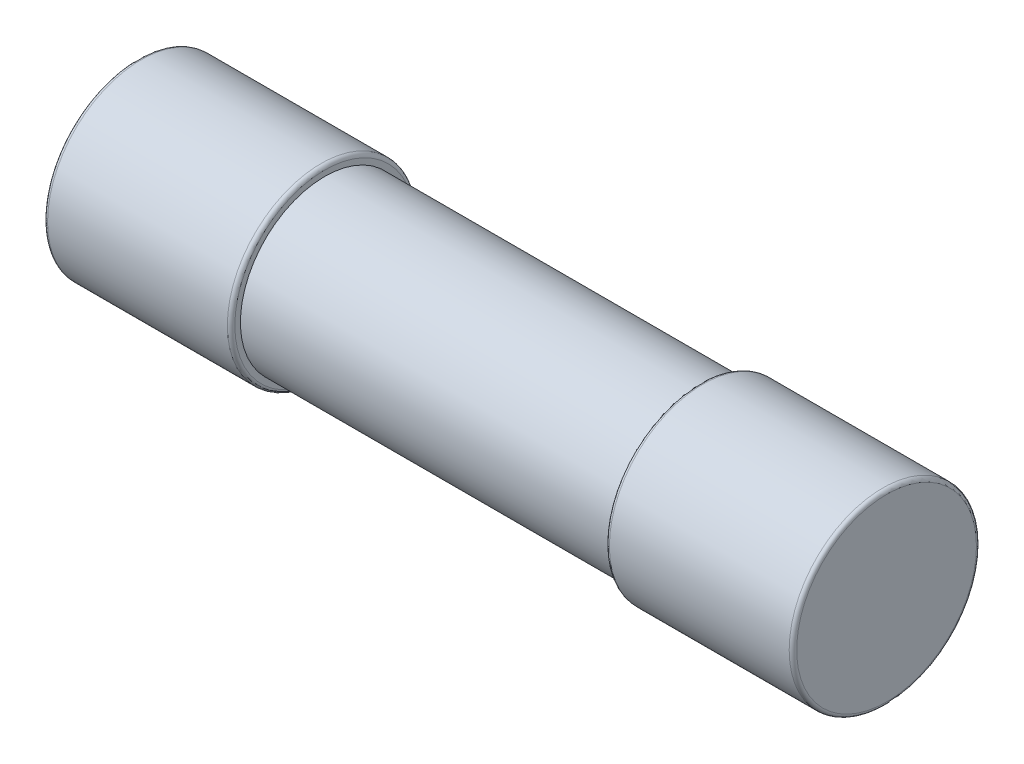
ISO-10303-21;
HEADER;
FILE_DESCRIPTION(('STEP AP214'),'2;1');
FILE_NAME('part.step','',(''),(''),'','','');
FILE_SCHEMA(('AUTOMOTIVE_DESIGN { 1 0 10303 214 1 1 1 1 }'));
ENDSEC;
DATA;
#1=APPLICATION_CONTEXT('core data for automotive mechanical design processes');
#2=APPLICATION_PROTOCOL_DEFINITION('international standard','automotive_design',2000,#1);
#3=PRODUCT_CONTEXT('',#1,'mechanical');
#4=PRODUCT('Part','Part','',(#3));
#5=PRODUCT_RELATED_PRODUCT_CATEGORY('part','',(#4));
#6=PRODUCT_DEFINITION_FORMATION('','',#4);
#7=PRODUCT_DEFINITION_CONTEXT('part definition',#1,'design');
#8=PRODUCT_DEFINITION('design','',#6,#7);
#9=PRODUCT_DEFINITION_SHAPE('','',#8);
#10=(LENGTH_UNIT() NAMED_UNIT(*) SI_UNIT(.MILLI.,.METRE.));
#11=(NAMED_UNIT(*) PLANE_ANGLE_UNIT() SI_UNIT($,.RADIAN.));
#12=(NAMED_UNIT(*) SI_UNIT($,.STERADIAN.) SOLID_ANGLE_UNIT());
#13=UNCERTAINTY_MEASURE_WITH_UNIT(LENGTH_MEASURE(1.E-05),#10,'distance_accuracy_value','');
#14=(GEOMETRIC_REPRESENTATION_CONTEXT(3) GLOBAL_UNCERTAINTY_ASSIGNED_CONTEXT((#13)) GLOBAL_UNIT_ASSIGNED_CONTEXT((#10,
#11,#12)) REPRESENTATION_CONTEXT('',''));
#15=CARTESIAN_POINT('',(0.,0.,0.));
#16=DIRECTION('',(0.,0.,1.));
#17=DIRECTION('',(1.,0.,0.));
#18=AXIS2_PLACEMENT_3D('',#15,#16,#17);
#19=CARTESIAN_POINT('',(10.,0.,0.));
#20=DIRECTION('',(1.,0.,0.));
#21=DIRECTION('',(0.,0.,-1.));
#22=AXIS2_PLACEMENT_3D('',#19,#20,#21);
#23=PLANE('',#22);
#24=CARTESIAN_POINT('',(10.,0.,0.));
#25=DIRECTION('',(1.,0.,0.));
#26=DIRECTION('',(0.,0.,-1.));
#27=AXIS2_PLACEMENT_3D('',#24,#25,#26);
#28=CIRCLE('',#27,2.4);
#29=CARTESIAN_POINT('',(10.,0.,-2.4));
#30=VERTEX_POINT('',#29);
#31=EDGE_CURVE('E59',#30,#30,#28,.T.);
#32=ORIENTED_EDGE('',*,*,#31,.T.);
#33=EDGE_LOOP('',(#32));
#34=FACE_BOUND('',#33,.T.);
#35=ADVANCED_FACE('F44',(#34),#23,.T.);
#36=CARTESIAN_POINT('',(9.75,0.,0.));
#37=DIRECTION('',(1.,0.,0.));
#38=DIRECTION('',(0.,0.,-1.));
#39=AXIS2_PLACEMENT_3D('',#36,#37,#38);
#40=CYLINDRICAL_SURFACE('',#39,2.5);
#41=CARTESIAN_POINT('',(9.9,0.,0.));
#42=DIRECTION('',(1.,0.,0.));
#43=DIRECTION('',(0.,0.,-1.));
#44=AXIS2_PLACEMENT_3D('',#41,#42,#43);
#45=CIRCLE('',#44,2.5);
#46=CARTESIAN_POINT('',(9.9,0.,-2.5));
#47=VERTEX_POINT('',#46);
#48=EDGE_CURVE('E51',#47,#47,#45,.F.);
#49=ORIENTED_EDGE('',*,*,#48,.T.);
#50=EDGE_LOOP('',(#49));
#51=FACE_BOUND('',#50,.T.);
#52=CARTESIAN_POINT('',(5.1,0.,0.));
#53=DIRECTION('',(-1.,0.,0.));
#54=DIRECTION('',(0.,0.,1.));
#55=AXIS2_PLACEMENT_3D('',#52,#53,#54);
#56=CIRCLE('',#55,2.5);
#57=CARTESIAN_POINT('',(5.1,0.,2.5));
#58=VERTEX_POINT('',#57);
#59=EDGE_CURVE('E55',#58,#58,#56,.F.);
#60=ORIENTED_EDGE('',*,*,#59,.T.);
#61=EDGE_LOOP('',(#60));
#62=FACE_BOUND('',#61,.T.);
#63=ADVANCED_FACE('F113',(#51,#62),#40,.T.);
#64=CARTESIAN_POINT('',(5.,0.,0.));
#65=DIRECTION('',(-1.,0.,0.));
#66=DIRECTION('',(0.,0.,1.));
#67=AXIS2_PLACEMENT_3D('',#64,#65,#66);
#68=PLANE('',#67);
#69=CARTESIAN_POINT('',(5.,0.,0.));
#70=DIRECTION('',(-1.,0.,0.));
#71=DIRECTION('',(0.,0.,1.));
#72=AXIS2_PLACEMENT_3D('',#69,#70,#71);
#73=CIRCLE('',#72,2.4);
#74=CARTESIAN_POINT('',(5.,0.,2.4));
#75=VERTEX_POINT('',#74);
#76=EDGE_CURVE('E11',#75,#75,#73,.T.);
#77=ORIENTED_EDGE('',*,*,#76,.T.);
#78=EDGE_LOOP('',(#77));
#79=FACE_BOUND('',#78,.T.);
#80=CARTESIAN_POINT('',(5.,0.,0.));
#81=DIRECTION('',(1.,0.,0.));
#82=DIRECTION('',(0.,0.,-1.));
#83=AXIS2_PLACEMENT_3D('',#80,#81,#82);
#84=CIRCLE('',#83,2.25);
#85=CARTESIAN_POINT('',(5.,0.,-2.25));
#86=VERTEX_POINT('',#85);
#87=EDGE_CURVE('E76',#86,#86,#84,.T.);
#88=ORIENTED_EDGE('',*,*,#87,.T.);
#89=EDGE_LOOP('',(#88));
#90=FACE_BOUND('',#89,.T.);
#91=ADVANCED_FACE('F119',(#79,#90),#68,.T.);
#92=CARTESIAN_POINT('',(9.75,0.,0.));
#93=DIRECTION('',(1.,0.,0.));
#94=DIRECTION('',(0.,0.,-1.));
#95=AXIS2_PLACEMENT_3D('',#92,#93,#94);
#96=CYLINDRICAL_SURFACE('',#95,2.25);
#97=CARTESIAN_POINT('',(9.75,0.,0.));
#98=DIRECTION('',(1.,0.,0.));
#99=DIRECTION('',(0.,0.,-1.));
#100=AXIS2_PLACEMENT_3D('',#97,#98,#99);
#101=CIRCLE('',#100,2.25);
#102=CARTESIAN_POINT('',(9.75,0.,-2.25));
#103=VERTEX_POINT('',#102);
#104=EDGE_CURVE('E79',#103,#103,#101,.T.);
#105=ORIENTED_EDGE('',*,*,#104,.T.);
#106=EDGE_LOOP('',(#105));
#107=FACE_BOUND('',#106,.T.);
#108=ORIENTED_EDGE('',*,*,#87,.F.);
#109=EDGE_LOOP('',(#108));
#110=FACE_BOUND('',#109,.T.);
#111=ADVANCED_FACE('F189',(#107,#110),#96,.F.);
#112=CARTESIAN_POINT('',(9.75,0.,0.));
#113=DIRECTION('',(-1.,0.,0.));
#114=DIRECTION('',(0.,0.,1.));
#115=AXIS2_PLACEMENT_3D('',#112,#113,#114);
#116=PLANE('',#115);
#117=CARTESIAN_POINT('',(9.75,0.,0.));
#118=DIRECTION('',(1.,0.,0.));
#119=DIRECTION('',(0.,0.,-1.));
#120=AXIS2_PLACEMENT_3D('',#117,#118,#119);
#121=CIRCLE('',#120,0.100000000000001);
#122=CARTESIAN_POINT('',(9.75,0.,-0.100000000000001));
#123=VERTEX_POINT('',#122);
#124=EDGE_CURVE('E82',#123,#123,#121,.T.);
#125=ORIENTED_EDGE('',*,*,#124,.T.);
#126=EDGE_LOOP('',(#125));
#127=FACE_BOUND('',#126,.T.);
#128=ORIENTED_EDGE('',*,*,#104,.F.);
#129=EDGE_LOOP('',(#128));
#130=FACE_BOUND('',#129,.T.);
#131=ADVANCED_FACE('F224',(#127,#130),#116,.T.);
#132=CARTESIAN_POINT('',(9.75,0.,0.));
#133=DIRECTION('',(1.,0.,0.));
#134=DIRECTION('',(0.,0.,-1.));
#135=AXIS2_PLACEMENT_3D('',#132,#133,#134);
#136=CYLINDRICAL_SURFACE('',#135,0.1);
#137=ORIENTED_EDGE('',*,*,#124,.F.);
#138=EDGE_LOOP('',(#137));
#139=FACE_BOUND('',#138,.T.);
#140=CARTESIAN_POINT('',(-9.75,0.,0.));
#141=DIRECTION('',(1.,0.,0.));
#142=DIRECTION('',(0.,0.,-1.));
#143=AXIS2_PLACEMENT_3D('',#140,#141,#142);
#144=CIRCLE('',#143,0.099999999999999);
#145=CARTESIAN_POINT('',(-9.75,0.,-0.099999999999999));
#146=VERTEX_POINT('',#145);
#147=EDGE_CURVE('E85',#146,#146,#144,.T.);
#148=ORIENTED_EDGE('',*,*,#147,.T.);
#149=EDGE_LOOP('',(#148));
#150=FACE_BOUND('',#149,.T.);
#151=ADVANCED_FACE('F214',(#139,#150),#136,.T.);
#152=CARTESIAN_POINT('',(-9.75,0.,0.));
#153=DIRECTION('',(-1.,0.,0.));
#154=DIRECTION('',(0.,0.,1.));
#155=AXIS2_PLACEMENT_3D('',#152,#153,#154);
#156=PLANE('',#155);
#157=ORIENTED_EDGE('',*,*,#147,.F.);
#158=EDGE_LOOP('',(#157));
#159=FACE_BOUND('',#158,.T.);
#160=CARTESIAN_POINT('',(-9.75,0.,0.));
#161=DIRECTION('',(1.,0.,0.));
#162=DIRECTION('',(0.,0.,-1.));
#163=AXIS2_PLACEMENT_3D('',#160,#161,#162);
#164=CIRCLE('',#163,2.25);
#165=CARTESIAN_POINT('',(-9.75,0.,-2.25));
#166=VERTEX_POINT('',#165);
#167=EDGE_CURVE('E88',#166,#166,#164,.T.);
#168=ORIENTED_EDGE('',*,*,#167,.T.);
#169=EDGE_LOOP('',(#168));
#170=FACE_BOUND('',#169,.T.);
#171=ADVANCED_FACE('F109',(#159,#170),#156,.F.);
#172=CARTESIAN_POINT('',(9.75,0.,0.));
#173=DIRECTION('',(1.,0.,0.));
#174=DIRECTION('',(0.,0.,-1.));
#175=AXIS2_PLACEMENT_3D('',#172,#173,#174);
#176=CYLINDRICAL_SURFACE('',#175,2.25);
#177=ORIENTED_EDGE('',*,*,#167,.F.);
#178=EDGE_LOOP('',(#177));
#179=FACE_BOUND('',#178,.T.);
#180=CARTESIAN_POINT('',(-5.,0.,0.));
#181=DIRECTION('',(1.,0.,0.));
#182=DIRECTION('',(0.,0.,-1.));
#183=AXIS2_PLACEMENT_3D('',#180,#181,#182);
#184=CIRCLE('',#183,2.25);
#185=CARTESIAN_POINT('',(-5.,0.,-2.25));
#186=VERTEX_POINT('',#185);
#187=EDGE_CURVE('E91',#186,#186,#184,.T.);
#188=ORIENTED_EDGE('',*,*,#187,.T.);
#189=EDGE_LOOP('',(#188));
#190=FACE_BOUND('',#189,.T.);
#191=ADVANCED_FACE('F95',(#179,#190),#176,.F.);
#192=CARTESIAN_POINT('',(-5.,0.,0.));
#193=DIRECTION('',(-1.,0.,0.));
#194=DIRECTION('',(0.,0.,1.));
#195=AXIS2_PLACEMENT_3D('',#192,#193,#194);
#196=PLANE('',#195);
#197=CARTESIAN_POINT('',(-5.,0.,0.));
#198=DIRECTION('',(-1.,0.,0.));
#199=DIRECTION('',(0.,0.,1.));
#200=AXIS2_PLACEMENT_3D('',#197,#198,#199);
#201=CIRCLE('',#200,2.4);
#202=CARTESIAN_POINT('',(-5.,0.,2.4));
#203=VERTEX_POINT('',#202);
#204=EDGE_CURVE('E64',#203,#203,#201,.F.);
#205=ORIENTED_EDGE('',*,*,#204,.T.);
#206=EDGE_LOOP('',(#205));
#207=FACE_BOUND('',#206,.T.);
#208=ORIENTED_EDGE('',*,*,#187,.F.);
#209=EDGE_LOOP('',(#208));
#210=FACE_BOUND('',#209,.T.);
#211=ADVANCED_FACE('F97',(#207,#210),#196,.F.);
#212=CARTESIAN_POINT('',(9.75,0.,0.));
#213=DIRECTION('',(1.,0.,0.));
#214=DIRECTION('',(0.,0.,-1.));
#215=AXIS2_PLACEMENT_3D('',#212,#213,#214);
#216=CYLINDRICAL_SURFACE('',#215,2.5);
#217=CARTESIAN_POINT('',(-9.9,0.,0.));
#218=DIRECTION('',(1.,0.,0.));
#219=DIRECTION('',(0.,0.,-1.));
#220=AXIS2_PLACEMENT_3D('',#217,#218,#219);
#221=CIRCLE('',#220,2.5);
#222=CARTESIAN_POINT('',(-9.9,0.,-2.5));
#223=VERTEX_POINT('',#222);
#224=EDGE_CURVE('E70',#223,#223,#221,.T.);
#225=ORIENTED_EDGE('',*,*,#224,.T.);
#226=EDGE_LOOP('',(#225));
#227=FACE_BOUND('',#226,.T.);
#228=CARTESIAN_POINT('',(-5.1,0.,0.));
#229=DIRECTION('',(-1.,0.,0.));
#230=DIRECTION('',(0.,0.,1.));
#231=AXIS2_PLACEMENT_3D('',#228,#229,#230);
#232=CIRCLE('',#231,2.5);
#233=CARTESIAN_POINT('',(-5.1,0.,2.5));
#234=VERTEX_POINT('',#233);
#235=EDGE_CURVE('E73',#234,#234,#232,.T.);
#236=ORIENTED_EDGE('',*,*,#235,.T.);
#237=EDGE_LOOP('',(#236));
#238=FACE_BOUND('',#237,.T.);
#239=ADVANCED_FACE('F99',(#227,#238),#216,.T.);
#240=CARTESIAN_POINT('',(-10.,0.,0.));
#241=DIRECTION('',(1.,0.,0.));
#242=DIRECTION('',(0.,0.,-1.));
#243=AXIS2_PLACEMENT_3D('',#240,#241,#242);
#244=PLANE('',#243);
#245=CARTESIAN_POINT('',(-10.,0.,0.));
#246=DIRECTION('',(1.,0.,0.));
#247=DIRECTION('',(0.,0.,-1.));
#248=AXIS2_PLACEMENT_3D('',#245,#246,#247);
#249=CIRCLE('',#248,2.4);
#250=CARTESIAN_POINT('',(-10.,0.,-2.4));
#251=VERTEX_POINT('',#250);
#252=EDGE_CURVE('E67',#251,#251,#249,.F.);
#253=ORIENTED_EDGE('',*,*,#252,.T.);
#254=EDGE_LOOP('',(#253));
#255=FACE_BOUND('',#254,.T.);
#256=ADVANCED_FACE('F106',(#255),#244,.F.);
#257=CARTESIAN_POINT('',(-9.9,0.,0.));
#258=DIRECTION('',(1.,0.,0.));
#259=DIRECTION('',(0.,0.,-1.));
#260=AXIS2_PLACEMENT_3D('',#257,#258,#259);
#261=TOROIDAL_SURFACE('',#260,2.4,0.1);
#262=ORIENTED_EDGE('',*,*,#252,.F.);
#263=EDGE_LOOP('',(#262));
#264=FACE_BOUND('',#263,.T.);
#265=ORIENTED_EDGE('',*,*,#224,.F.);
#266=EDGE_LOOP('',(#265));
#267=FACE_BOUND('',#266,.T.);
#268=ADVANCED_FACE('F123',(#264,#267),#261,.T.);
#269=CARTESIAN_POINT('',(-5.1,0.,0.));
#270=DIRECTION('',(-1.,0.,0.));
#271=DIRECTION('',(0.,0.,1.));
#272=AXIS2_PLACEMENT_3D('',#269,#270,#271);
#273=TOROIDAL_SURFACE('',#272,2.4,0.1);
#274=ORIENTED_EDGE('',*,*,#235,.F.);
#275=EDGE_LOOP('',(#274));
#276=FACE_BOUND('',#275,.T.);
#277=ORIENTED_EDGE('',*,*,#204,.F.);
#278=EDGE_LOOP('',(#277));
#279=FACE_BOUND('',#278,.T.);
#280=ADVANCED_FACE('F126',(#276,#279),#273,.T.);
#281=CARTESIAN_POINT('',(9.9,0.,0.));
#282=DIRECTION('',(1.,0.,0.));
#283=DIRECTION('',(0.,0.,-1.));
#284=AXIS2_PLACEMENT_3D('',#281,#282,#283);
#285=TOROIDAL_SURFACE('',#284,2.4,0.1);
#286=ORIENTED_EDGE('',*,*,#48,.F.);
#287=EDGE_LOOP('',(#286));
#288=FACE_BOUND('',#287,.T.);
#289=ORIENTED_EDGE('',*,*,#31,.F.);
#290=EDGE_LOOP('',(#289));
#291=FACE_BOUND('',#290,.T.);
#292=ADVANCED_FACE('F129',(#288,#291),#285,.T.);
#293=CARTESIAN_POINT('',(5.1,0.,0.));
#294=DIRECTION('',(-1.,0.,0.));
#295=DIRECTION('',(0.,0.,1.));
#296=AXIS2_PLACEMENT_3D('',#293,#294,#295);
#297=TOROIDAL_SURFACE('',#296,2.4,0.1);
#298=ORIENTED_EDGE('',*,*,#76,.F.);
#299=EDGE_LOOP('',(#298));
#300=FACE_BOUND('',#299,.T.);
#301=ORIENTED_EDGE('',*,*,#59,.F.);
#302=EDGE_LOOP('',(#301));
#303=FACE_BOUND('',#302,.T.);
#304=ADVANCED_FACE('F46',(#300,#303),#297,.T.);
#305=CLOSED_SHELL('',(#35,#63,#91,#111,#131,#151,#171,#191,#211,#239,#256,#268,#280,#292,#304));
#306=MANIFOLD_SOLID_BREP('B2',#305);
#307=CARTESIAN_POINT('',(-9.75,0.,0.));
#308=DIRECTION('',(1.,0.,0.));
#309=DIRECTION('',(0.,1.,0.));
#310=AXIS2_PLACEMENT_3D('',#307,#308,#309);
#311=PLANE('',#310);
#312=CARTESIAN_POINT('',(-9.75,0.,0.));
#313=DIRECTION('',(1.,0.,0.));
#314=DIRECTION('',(0.,1.,0.));
#315=AXIS2_PLACEMENT_3D('',#312,#313,#314);
#316=CIRCLE('',#315,2.25);
#317=CARTESIAN_POINT('',(-9.75,2.25,0.));
#318=VERTEX_POINT('',#317);
#319=EDGE_CURVE('E278',#318,#318,#316,.T.);
#320=ORIENTED_EDGE('',*,*,#319,.F.);
#321=EDGE_LOOP('',(#320));
#322=FACE_BOUND('',#321,.T.);
#323=CARTESIAN_POINT('',(-9.75,0.,0.));
#324=DIRECTION('',(1.,0.,0.));
#325=DIRECTION('',(0.,1.,0.));
#326=AXIS2_PLACEMENT_3D('',#323,#324,#325);
#327=CIRCLE('',#326,2.);
#328=CARTESIAN_POINT('',(-9.75,2.,0.));
#329=VERTEX_POINT('',#328);
#330=EDGE_CURVE('E43',#329,#329,#327,.T.);
#331=ORIENTED_EDGE('',*,*,#330,.T.);
#332=EDGE_LOOP('',(#331));
#333=FACE_BOUND('',#332,.T.);
#334=ADVANCED_FACE('F264',(#322,#333),#311,.F.);
#335=CARTESIAN_POINT('',(0.,0.,0.));
#336=DIRECTION('',(1.,0.,0.));
#337=DIRECTION('',(0.,1.,0.));
#338=AXIS2_PLACEMENT_3D('',#335,#336,#337);
#339=CYLINDRICAL_SURFACE('',#338,2.);
#340=CARTESIAN_POINT('',(9.75,0.,0.));
#341=DIRECTION('',(1.,0.,0.));
#342=DIRECTION('',(0.,1.,0.));
#343=AXIS2_PLACEMENT_3D('',#340,#341,#342);
#344=CIRCLE('',#343,2.);
#345=CARTESIAN_POINT('',(9.75,2.,0.));
#346=VERTEX_POINT('',#345);
#347=EDGE_CURVE('E270',#346,#346,#344,.T.);
#348=ORIENTED_EDGE('',*,*,#347,.T.);
#349=EDGE_LOOP('',(#348));
#350=FACE_BOUND('',#349,.T.);
#351=ORIENTED_EDGE('',*,*,#330,.F.);
#352=EDGE_LOOP('',(#351));
#353=FACE_BOUND('',#352,.T.);
#354=ADVANCED_FACE('F287',(#350,#353),#339,.F.);
#355=CARTESIAN_POINT('',(9.75,0.,0.));
#356=DIRECTION('',(-1.,0.,0.));
#357=DIRECTION('',(0.,-1.,0.));
#358=AXIS2_PLACEMENT_3D('',#355,#356,#357);
#359=PLANE('',#358);
#360=ORIENTED_EDGE('',*,*,#347,.F.);
#361=EDGE_LOOP('',(#360));
#362=FACE_BOUND('',#361,.T.);
#363=CARTESIAN_POINT('',(9.75,0.,0.));
#364=DIRECTION('',(1.,0.,0.));
#365=DIRECTION('',(0.,1.,0.));
#366=AXIS2_PLACEMENT_3D('',#363,#364,#365);
#367=CIRCLE('',#366,2.25);
#368=CARTESIAN_POINT('',(9.75,2.25,0.));
#369=VERTEX_POINT('',#368);
#370=EDGE_CURVE('E274',#369,#369,#367,.T.);
#371=ORIENTED_EDGE('',*,*,#370,.T.);
#372=EDGE_LOOP('',(#371));
#373=FACE_BOUND('',#372,.T.);
#374=ADVANCED_FACE('F291',(#362,#373),#359,.F.);
#375=CARTESIAN_POINT('',(0.,0.,0.));
#376=DIRECTION('',(1.,0.,0.));
#377=DIRECTION('',(0.,1.,0.));
#378=AXIS2_PLACEMENT_3D('',#375,#376,#377);
#379=CYLINDRICAL_SURFACE('',#378,2.25);
#380=ORIENTED_EDGE('',*,*,#370,.F.);
#381=EDGE_LOOP('',(#380));
#382=FACE_BOUND('',#381,.T.);
#383=ORIENTED_EDGE('',*,*,#319,.T.);
#384=EDGE_LOOP('',(#383));
#385=FACE_BOUND('',#384,.T.);
#386=ADVANCED_FACE('F284',(#382,#385),#379,.T.);
#387=CLOSED_SHELL('',(#334,#354,#374,#386));
#388=MANIFOLD_SOLID_BREP('B6',#387);
#389=ADVANCED_BREP_SHAPE_REPRESENTATION('',(#18,#306,#388),#14);
#390=SHAPE_DEFINITION_REPRESENTATION(#9,#389);
ENDSEC;
END-ISO-10303-21;
